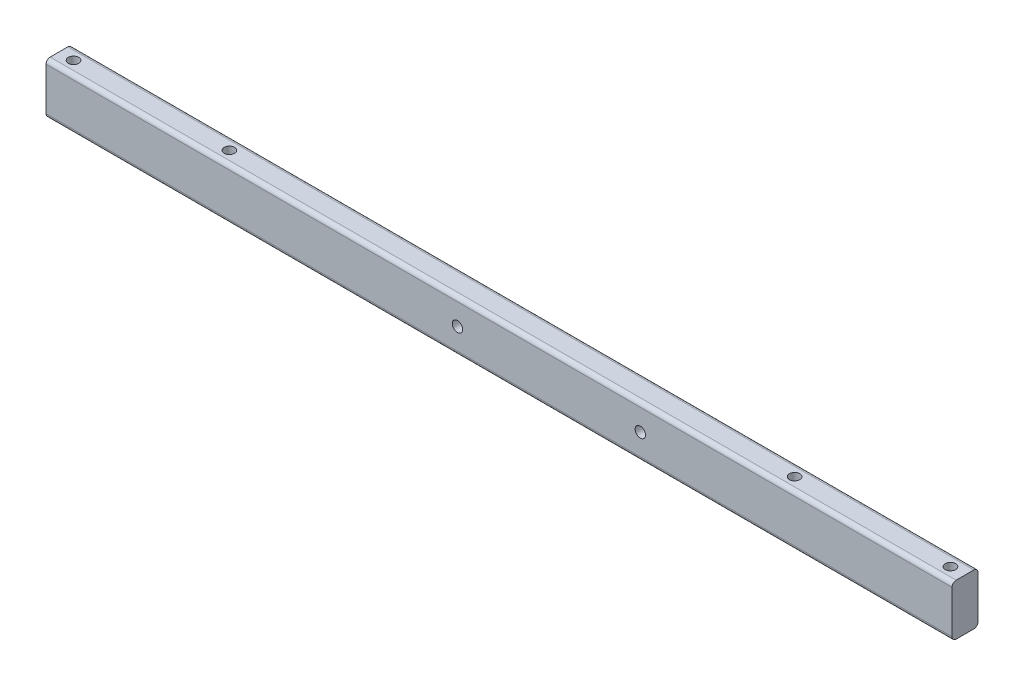
ISO-10303-21;
HEADER;
FILE_DESCRIPTION(('STEP AP214'),'2;1');
FILE_NAME('part.step','',(''),(''),'','','');
FILE_SCHEMA(('AUTOMOTIVE_DESIGN { 1 0 10303 214 1 1 1 1 }'));
ENDSEC;
DATA;
#1=APPLICATION_CONTEXT('core data for automotive mechanical design processes');
#2=APPLICATION_PROTOCOL_DEFINITION('international standard','automotive_design',2000,#1);
#3=PRODUCT_CONTEXT('',#1,'mechanical');
#4=PRODUCT('Part','Part','',(#3));
#5=PRODUCT_RELATED_PRODUCT_CATEGORY('part','',(#4));
#6=PRODUCT_DEFINITION_FORMATION('','',#4);
#7=PRODUCT_DEFINITION_CONTEXT('part definition',#1,'design');
#8=PRODUCT_DEFINITION('design','',#6,#7);
#9=PRODUCT_DEFINITION_SHAPE('','',#8);
#10=(LENGTH_UNIT() NAMED_UNIT(*) SI_UNIT(.MILLI.,.METRE.));
#11=(NAMED_UNIT(*) PLANE_ANGLE_UNIT() SI_UNIT($,.RADIAN.));
#12=(NAMED_UNIT(*) SI_UNIT($,.STERADIAN.) SOLID_ANGLE_UNIT());
#13=UNCERTAINTY_MEASURE_WITH_UNIT(LENGTH_MEASURE(1.E-05),#10,'distance_accuracy_value','');
#14=(GEOMETRIC_REPRESENTATION_CONTEXT(3) GLOBAL_UNCERTAINTY_ASSIGNED_CONTEXT((#13)) GLOBAL_UNIT_ASSIGNED_CONTEXT((#10,
#11,#12)) REPRESENTATION_CONTEXT('',''));
#15=CARTESIAN_POINT('',(0.,0.,0.));
#16=DIRECTION('',(0.,0.,1.));
#17=DIRECTION('',(1.,0.,0.));
#18=AXIS2_PLACEMENT_3D('',#15,#16,#17);
#19=CARTESIAN_POINT('',(0.,0.,6.25));
#20=DIRECTION('',(0.,0.,1.));
#21=DIRECTION('',(-1.,0.,0.));
#22=AXIS2_PLACEMENT_3D('',#19,#20,#21);
#23=PLANE('',#22);
#24=DIRECTION('',(0.,-1.,0.));
#25=VECTOR('',#24,1.);
#26=CARTESIAN_POINT('',(0.,0.,6.25));
#27=LINE('',#26,#25);
#28=CARTESIAN_POINT('',(0.,11.3,6.25));
#29=VERTEX_POINT('',#28);
#30=CARTESIAN_POINT('',(0.,1.,6.25));
#31=VERTEX_POINT('',#30);
#32=EDGE_CURVE('E129',#29,#31,#27,.T.);
#33=ORIENTED_EDGE('',*,*,#32,.F.);
#34=DIRECTION('',(-1.,0.,0.));
#35=VECTOR('',#34,1.);
#36=CARTESIAN_POINT('',(0.,11.3,6.25));
#37=LINE('',#36,#35);
#38=CARTESIAN_POINT('',(218.,11.3,6.25));
#39=VERTEX_POINT('',#38);
#40=EDGE_CURVE('E44',#39,#29,#37,.T.);
#41=ORIENTED_EDGE('',*,*,#40,.F.);
#42=DIRECTION('',(0.,1.,0.));
#43=VECTOR('',#42,1.);
#44=CARTESIAN_POINT('',(218.,0.,6.25));
#45=LINE('',#44,#43);
#46=CARTESIAN_POINT('',(218.,1.,6.25));
#47=VERTEX_POINT('',#46);
#48=EDGE_CURVE('E124',#47,#39,#45,.T.);
#49=ORIENTED_EDGE('',*,*,#48,.F.);
#50=DIRECTION('',(1.,0.,0.));
#51=VECTOR('',#50,1.);
#52=CARTESIAN_POINT('',(0.,1.,6.25));
#53=LINE('',#52,#51);
#54=EDGE_CURVE('E11',#31,#47,#53,.T.);
#55=ORIENTED_EDGE('',*,*,#54,.F.);
#56=EDGE_LOOP('',(#33,#41,#49,#55));
#57=FACE_BOUND('',#56,.T.);
#58=CARTESIAN_POINT('',(143.,6.15,6.25));
#59=DIRECTION('',(0.,0.,1.));
#60=DIRECTION('',(1.,0.,0.));
#61=AXIS2_PLACEMENT_3D('',#58,#59,#60);
#62=CIRCLE('',#61,1.25000000000001);
#63=CARTESIAN_POINT('',(144.25,6.15,6.25));
#64=VERTEX_POINT('',#63);
#65=EDGE_CURVE('E181',#64,#64,#62,.T.);
#66=ORIENTED_EDGE('',*,*,#65,.T.);
#67=EDGE_LOOP('',(#66));
#68=FACE_BOUND('',#67,.T.);
#69=CARTESIAN_POINT('',(99.,6.15,6.25));
#70=DIRECTION('',(0.,0.,1.));
#71=DIRECTION('',(1.,0.,0.));
#72=AXIS2_PLACEMENT_3D('',#69,#70,#71);
#73=CIRCLE('',#72,1.25);
#74=CARTESIAN_POINT('',(100.25,6.15,6.25));
#75=VERTEX_POINT('',#74);
#76=EDGE_CURVE('E188',#75,#75,#73,.T.);
#77=ORIENTED_EDGE('',*,*,#76,.T.);
#78=EDGE_LOOP('',(#77));
#79=FACE_BOUND('',#78,.T.);
#80=ADVANCED_FACE('F36',(#57,#68,#79),#23,.F.);
#81=CARTESIAN_POINT('',(0.,0.,12.5));
#82=DIRECTION('',(0.,0.,1.));
#83=DIRECTION('',(-1.,0.,0.));
#84=AXIS2_PLACEMENT_3D('',#81,#82,#83);
#85=PLANE('',#84);
#86=CARTESIAN_POINT('',(143.,6.15,12.5));
#87=DIRECTION('',(0.,0.,1.));
#88=DIRECTION('',(1.,0.,0.));
#89=AXIS2_PLACEMENT_3D('',#86,#87,#88);
#90=CIRCLE('',#89,1.25000000000001);
#91=CARTESIAN_POINT('',(144.25,6.15,12.5));
#92=VERTEX_POINT('',#91);
#93=EDGE_CURVE('E178',#92,#92,#90,.T.);
#94=ORIENTED_EDGE('',*,*,#93,.F.);
#95=EDGE_LOOP('',(#94));
#96=FACE_BOUND('',#95,.T.);
#97=DIRECTION('',(0.,-1.,0.));
#98=VECTOR('',#97,1.);
#99=CARTESIAN_POINT('',(0.,0.,12.5));
#100=LINE('',#99,#98);
#101=CARTESIAN_POINT('',(0.,11.3,12.5));
#102=VERTEX_POINT('',#101);
#103=CARTESIAN_POINT('',(0.,1.,12.5));
#104=VERTEX_POINT('',#103);
#105=EDGE_CURVE('E176',#102,#104,#100,.T.);
#106=ORIENTED_EDGE('',*,*,#105,.T.);
#107=DIRECTION('',(1.,0.,0.));
#108=VECTOR('',#107,1.);
#109=CARTESIAN_POINT('',(0.,1.,12.5));
#110=LINE('',#109,#108);
#111=CARTESIAN_POINT('',(218.,1.,12.5));
#112=VERTEX_POINT('',#111);
#113=EDGE_CURVE('E145',#112,#104,#110,.F.);
#114=ORIENTED_EDGE('',*,*,#113,.F.);
#115=DIRECTION('',(0.,1.,0.));
#116=VECTOR('',#115,1.);
#117=CARTESIAN_POINT('',(218.,0.,12.5));
#118=LINE('',#117,#116);
#119=CARTESIAN_POINT('',(218.,11.3,12.5));
#120=VERTEX_POINT('',#119);
#121=EDGE_CURVE('E132',#112,#120,#118,.T.);
#122=ORIENTED_EDGE('',*,*,#121,.T.);
#123=DIRECTION('',(-1.,0.,0.));
#124=VECTOR('',#123,1.);
#125=CARTESIAN_POINT('',(218.,11.3,12.5));
#126=LINE('',#125,#124);
#127=EDGE_CURVE('E148',#102,#120,#126,.F.);
#128=ORIENTED_EDGE('',*,*,#127,.F.);
#129=EDGE_LOOP('',(#106,#114,#122,#128));
#130=FACE_BOUND('',#129,.T.);
#131=CARTESIAN_POINT('',(99.,6.15,12.5));
#132=DIRECTION('',(0.,0.,1.));
#133=DIRECTION('',(1.,0.,0.));
#134=AXIS2_PLACEMENT_3D('',#131,#132,#133);
#135=CIRCLE('',#134,1.25);
#136=CARTESIAN_POINT('',(100.25,6.15,12.5));
#137=VERTEX_POINT('',#136);
#138=EDGE_CURVE('E190',#137,#137,#135,.T.);
#139=ORIENTED_EDGE('',*,*,#138,.F.);
#140=EDGE_LOOP('',(#139));
#141=FACE_BOUND('',#140,.T.);
#142=ADVANCED_FACE('F236',(#96,#130,#141),#85,.T.);
#143=CARTESIAN_POINT('',(0.,0.,6.25));
#144=DIRECTION('',(1.,0.,0.));
#145=DIRECTION('',(0.,0.,1.));
#146=AXIS2_PLACEMENT_3D('',#143,#144,#145);
#147=PLANE('',#146);
#148=DIRECTION('',(0.,0.,1.));
#149=VECTOR('',#148,1.);
#150=CARTESIAN_POINT('',(0.,12.3,6.25));
#151=LINE('',#150,#149);
#152=CARTESIAN_POINT('',(0.,12.3,7.25));
#153=VERTEX_POINT('',#152);
#154=CARTESIAN_POINT('',(0.,12.3,11.5));
#155=VERTEX_POINT('',#154);
#156=EDGE_CURVE('E104',#153,#155,#151,.T.);
#157=ORIENTED_EDGE('',*,*,#156,.F.);
#158=CARTESIAN_POINT('',(0.,11.3,7.25));
#159=DIRECTION('',(-1.,0.,0.));
#160=DIRECTION('',(0.,0.,1.));
#161=AXIS2_PLACEMENT_3D('',#158,#159,#160);
#162=CIRCLE('',#161,1.);
#163=EDGE_CURVE('E113',#29,#153,#162,.F.);
#164=ORIENTED_EDGE('',*,*,#163,.F.);
#165=ORIENTED_EDGE('',*,*,#32,.T.);
#166=CARTESIAN_POINT('',(0.,1.,7.25));
#167=DIRECTION('',(-1.,0.,0.));
#168=DIRECTION('',(0.,0.,1.));
#169=AXIS2_PLACEMENT_3D('',#166,#167,#168);
#170=CIRCLE('',#169,1.);
#171=CARTESIAN_POINT('',(0.,0.,7.25));
#172=VERTEX_POINT('',#171);
#173=EDGE_CURVE('E118',#172,#31,#170,.F.);
#174=ORIENTED_EDGE('',*,*,#173,.F.);
#175=DIRECTION('',(0.,0.,1.));
#176=VECTOR('',#175,1.);
#177=CARTESIAN_POINT('',(0.,0.,6.25));
#178=LINE('',#177,#176);
#179=CARTESIAN_POINT('',(0.,0.,11.5));
#180=VERTEX_POINT('',#179);
#181=EDGE_CURVE('E110',#172,#180,#178,.T.);
#182=ORIENTED_EDGE('',*,*,#181,.T.);
#183=CARTESIAN_POINT('',(0.,1.,11.5));
#184=DIRECTION('',(-1.,0.,0.));
#185=DIRECTION('',(0.,0.,1.));
#186=AXIS2_PLACEMENT_3D('',#183,#184,#185);
#187=CIRCLE('',#186,1.);
#188=EDGE_CURVE('E141',#104,#180,#187,.F.);
#189=ORIENTED_EDGE('',*,*,#188,.F.);
#190=ORIENTED_EDGE('',*,*,#105,.F.);
#191=CARTESIAN_POINT('',(0.,11.3,11.5));
#192=DIRECTION('',(-1.,0.,0.));
#193=DIRECTION('',(0.,0.,1.));
#194=AXIS2_PLACEMENT_3D('',#191,#192,#193);
#195=CIRCLE('',#194,1.);
#196=EDGE_CURVE('E123',#155,#102,#195,.F.);
#197=ORIENTED_EDGE('',*,*,#196,.F.);
#198=EDGE_LOOP('',(#157,#164,#165,#174,#182,#189,#190,#197));
#199=FACE_BOUND('',#198,.T.);
#200=ADVANCED_FACE('F121',(#199),#147,.F.);
#201=CARTESIAN_POINT('',(0.,0.,6.25));
#202=DIRECTION('',(0.,1.,0.));
#203=DIRECTION('',(0.,0.,-1.));
#204=AXIS2_PLACEMENT_3D('',#201,#202,#203);
#205=PLANE('',#204);
#206=ORIENTED_EDGE('',*,*,#181,.F.);
#207=DIRECTION('',(1.,0.,0.));
#208=VECTOR('',#207,1.);
#209=CARTESIAN_POINT('',(0.,0.,7.25));
#210=LINE('',#209,#208);
#211=CARTESIAN_POINT('',(218.,0.,7.25));
#212=VERTEX_POINT('',#211);
#213=EDGE_CURVE('E158',#212,#172,#210,.F.);
#214=ORIENTED_EDGE('',*,*,#213,.F.);
#215=DIRECTION('',(0.,0.,1.));
#216=VECTOR('',#215,1.);
#217=CARTESIAN_POINT('',(218.,0.,6.25));
#218=LINE('',#217,#216);
#219=CARTESIAN_POINT('',(218.,0.,11.5));
#220=VERTEX_POINT('',#219);
#221=EDGE_CURVE('E126',#212,#220,#218,.T.);
#222=ORIENTED_EDGE('',*,*,#221,.T.);
#223=DIRECTION('',(1.,0.,0.));
#224=VECTOR('',#223,1.);
#225=CARTESIAN_POINT('',(218.,0.,11.5));
#226=LINE('',#225,#224);
#227=EDGE_CURVE('E160',#180,#220,#226,.T.);
#228=ORIENTED_EDGE('',*,*,#227,.F.);
#229=EDGE_LOOP('',(#206,#214,#222,#228));
#230=FACE_BOUND('',#229,.T.);
#231=ADVANCED_FACE('F166',(#230),#205,.F.);
#232=CARTESIAN_POINT('',(218.,0.,6.25));
#233=DIRECTION('',(-1.,0.,0.));
#234=DIRECTION('',(0.,0.,-1.));
#235=AXIS2_PLACEMENT_3D('',#232,#233,#234);
#236=PLANE('',#235);
#237=ORIENTED_EDGE('',*,*,#121,.F.);
#238=CARTESIAN_POINT('',(218.,1.,11.5));
#239=DIRECTION('',(1.,0.,0.));
#240=DIRECTION('',(0.,0.,-1.));
#241=AXIS2_PLACEMENT_3D('',#238,#239,#240);
#242=CIRCLE('',#241,1.);
#243=EDGE_CURVE('E51',#220,#112,#242,.F.);
#244=ORIENTED_EDGE('',*,*,#243,.F.);
#245=ORIENTED_EDGE('',*,*,#221,.F.);
#246=CARTESIAN_POINT('',(218.,1.,7.25));
#247=DIRECTION('',(1.,0.,0.));
#248=DIRECTION('',(0.,0.,-1.));
#249=AXIS2_PLACEMENT_3D('',#246,#247,#248);
#250=CIRCLE('',#249,1.);
#251=EDGE_CURVE('E58',#47,#212,#250,.F.);
#252=ORIENTED_EDGE('',*,*,#251,.F.);
#253=ORIENTED_EDGE('',*,*,#48,.T.);
#254=CARTESIAN_POINT('',(218.,11.3,7.25));
#255=DIRECTION('',(1.,0.,0.));
#256=DIRECTION('',(0.,0.,-1.));
#257=AXIS2_PLACEMENT_3D('',#254,#255,#256);
#258=CIRCLE('',#257,1.);
#259=CARTESIAN_POINT('',(218.,12.3,7.25));
#260=VERTEX_POINT('',#259);
#261=EDGE_CURVE('E151',#260,#39,#258,.F.);
#262=ORIENTED_EDGE('',*,*,#261,.F.);
#263=DIRECTION('',(0.,0.,1.));
#264=VECTOR('',#263,1.);
#265=CARTESIAN_POINT('',(218.,12.3,6.25));
#266=LINE('',#265,#264);
#267=CARTESIAN_POINT('',(218.,12.3,11.5));
#268=VERTEX_POINT('',#267);
#269=EDGE_CURVE('E106',#260,#268,#266,.T.);
#270=ORIENTED_EDGE('',*,*,#269,.T.);
#271=CARTESIAN_POINT('',(218.,11.3,11.5));
#272=DIRECTION('',(1.,0.,0.));
#273=DIRECTION('',(0.,0.,-1.));
#274=AXIS2_PLACEMENT_3D('',#271,#272,#273);
#275=CIRCLE('',#274,1.);
#276=EDGE_CURVE('E155',#120,#268,#275,.F.);
#277=ORIENTED_EDGE('',*,*,#276,.F.);
#278=EDGE_LOOP('',(#237,#244,#245,#252,#253,#262,#270,#277));
#279=FACE_BOUND('',#278,.T.);
#280=ADVANCED_FACE('F167',(#279),#236,.F.);
#281=CARTESIAN_POINT('',(0.,12.3,6.25));
#282=DIRECTION('',(0.,-1.,0.));
#283=DIRECTION('',(0.,0.,1.));
#284=AXIS2_PLACEMENT_3D('',#281,#282,#283);
#285=PLANE('',#284);
#286=CARTESIAN_POINT('',(214.5,12.3,9.37500000000001));
#287=DIRECTION('',(0.,-1.,0.));
#288=DIRECTION('',(0.,0.,-1.));
#289=AXIS2_PLACEMENT_3D('',#286,#287,#288);
#290=CIRCLE('',#289,1.25000000000001);
#291=CARTESIAN_POINT('',(214.5,12.3,8.125));
#292=VERTEX_POINT('',#291);
#293=EDGE_CURVE('E209',#292,#292,#290,.T.);
#294=ORIENTED_EDGE('',*,*,#293,.T.);
#295=EDGE_LOOP('',(#294));
#296=FACE_BOUND('',#295,.T.);
#297=CARTESIAN_POINT('',(41.,12.3,9.37500000000001));
#298=DIRECTION('',(0.,-1.,0.));
#299=DIRECTION('',(0.,0.,1.));
#300=AXIS2_PLACEMENT_3D('',#297,#298,#299);
#301=CIRCLE('',#300,1.25000000000001);
#302=CARTESIAN_POINT('',(41.,12.3,10.625));
#303=VERTEX_POINT('',#302);
#304=EDGE_CURVE('E210',#303,#303,#301,.T.);
#305=ORIENTED_EDGE('',*,*,#304,.T.);
#306=EDGE_LOOP('',(#305));
#307=FACE_BOUND('',#306,.T.);
#308=CARTESIAN_POINT('',(3.5,12.3,9.37500000000001));
#309=DIRECTION('',(0.,-1.,0.));
#310=DIRECTION('',(0.,0.,1.));
#311=AXIS2_PLACEMENT_3D('',#308,#309,#310);
#312=CIRCLE('',#311,1.25000000000001);
#313=CARTESIAN_POINT('',(3.5,12.3,10.625));
#314=VERTEX_POINT('',#313);
#315=EDGE_CURVE('E196',#314,#314,#312,.T.);
#316=ORIENTED_EDGE('',*,*,#315,.T.);
#317=EDGE_LOOP('',(#316));
#318=FACE_BOUND('',#317,.T.);
#319=CARTESIAN_POINT('',(177.,12.3,9.37500000000001));
#320=DIRECTION('',(0.,-1.,0.));
#321=DIRECTION('',(0.,0.,-1.));
#322=AXIS2_PLACEMENT_3D('',#319,#320,#321);
#323=CIRCLE('',#322,1.25000000000001);
#324=CARTESIAN_POINT('',(177.,12.3,8.125));
#325=VERTEX_POINT('',#324);
#326=EDGE_CURVE('E203',#325,#325,#323,.T.);
#327=ORIENTED_EDGE('',*,*,#326,.T.);
#328=EDGE_LOOP('',(#327));
#329=FACE_BOUND('',#328,.T.);
#330=ORIENTED_EDGE('',*,*,#269,.F.);
#331=DIRECTION('',(-1.,0.,0.));
#332=VECTOR('',#331,1.);
#333=CARTESIAN_POINT('',(0.,12.3,7.25));
#334=LINE('',#333,#332);
#335=EDGE_CURVE('E100',#153,#260,#334,.F.);
#336=ORIENTED_EDGE('',*,*,#335,.F.);
#337=ORIENTED_EDGE('',*,*,#156,.T.);
#338=DIRECTION('',(-1.,0.,0.));
#339=VECTOR('',#338,1.);
#340=CARTESIAN_POINT('',(0.,12.3,11.5));
#341=LINE('',#340,#339);
#342=EDGE_CURVE('E109',#268,#155,#341,.T.);
#343=ORIENTED_EDGE('',*,*,#342,.F.);
#344=EDGE_LOOP('',(#330,#336,#337,#343));
#345=FACE_BOUND('',#344,.T.);
#346=ADVANCED_FACE('F102',(#296,#307,#318,#329,#345),#285,.F.);
#347=CARTESIAN_POINT('',(143.,6.15,6.25));
#348=DIRECTION('',(0.,0.,1.));
#349=DIRECTION('',(-1.,0.,0.));
#350=AXIS2_PLACEMENT_3D('',#347,#348,#349);
#351=CYLINDRICAL_SURFACE('',#350,1.25000000000001);
#352=ORIENTED_EDGE('',*,*,#65,.F.);
#353=EDGE_LOOP('',(#352));
#354=FACE_BOUND('',#353,.T.);
#355=ORIENTED_EDGE('',*,*,#93,.T.);
#356=EDGE_LOOP('',(#355));
#357=FACE_BOUND('',#356,.T.);
#358=ADVANCED_FACE('F244',(#354,#357),#351,.F.);
#359=CARTESIAN_POINT('',(99.,6.15,6.25));
#360=DIRECTION('',(0.,0.,1.));
#361=DIRECTION('',(-1.,0.,0.));
#362=AXIS2_PLACEMENT_3D('',#359,#360,#361);
#363=CYLINDRICAL_SURFACE('',#362,1.25);
#364=ORIENTED_EDGE('',*,*,#76,.F.);
#365=EDGE_LOOP('',(#364));
#366=FACE_BOUND('',#365,.T.);
#367=ORIENTED_EDGE('',*,*,#138,.T.);
#368=EDGE_LOOP('',(#367));
#369=FACE_BOUND('',#368,.T.);
#370=ADVANCED_FACE('F349',(#366,#369),#363,.F.);
#371=CARTESIAN_POINT('',(177.,4.3,9.37500000000001));
#372=DIRECTION('',(0.,1.,0.));
#373=DIRECTION('',(0.,0.,-1.));
#374=AXIS2_PLACEMENT_3D('',#371,#372,#373);
#375=CYLINDRICAL_SURFACE('',#374,1.25000000000001);
#376=CARTESIAN_POINT('',(177.,4.3,9.37500000000001));
#377=DIRECTION('',(0.,-1.,0.));
#378=DIRECTION('',(0.,0.,-1.));
#379=AXIS2_PLACEMENT_3D('',#376,#377,#378);
#380=CIRCLE('',#379,1.25000000000001);
#381=CARTESIAN_POINT('',(177.,4.3,8.125));
#382=VERTEX_POINT('',#381);
#383=EDGE_CURVE('E206',#382,#382,#380,.T.);
#384=ORIENTED_EDGE('',*,*,#383,.T.);
#385=EDGE_LOOP('',(#384));
#386=FACE_BOUND('',#385,.T.);
#387=ORIENTED_EDGE('',*,*,#326,.F.);
#388=EDGE_LOOP('',(#387));
#389=FACE_BOUND('',#388,.T.);
#390=ADVANCED_FACE('F339',(#386,#389),#375,.F.);
#391=CARTESIAN_POINT('',(177.,4.3,9.37500000000001));
#392=DIRECTION('',(0.,1.,0.));
#393=DIRECTION('',(0.,0.,-1.));
#394=AXIS2_PLACEMENT_3D('',#391,#392,#393);
#395=PLANE('',#394);
#396=ORIENTED_EDGE('',*,*,#383,.F.);
#397=EDGE_LOOP('',(#396));
#398=FACE_BOUND('',#397,.T.);
#399=ADVANCED_FACE('F329',(#398),#395,.T.);
#400=CARTESIAN_POINT('',(3.5,4.3,9.37500000000001));
#401=DIRECTION('',(0.,1.,0.));
#402=DIRECTION('',(0.,0.,-1.));
#403=AXIS2_PLACEMENT_3D('',#400,#401,#402);
#404=CYLINDRICAL_SURFACE('',#403,1.25000000000001);
#405=CARTESIAN_POINT('',(3.5,4.3,9.37500000000001));
#406=DIRECTION('',(0.,-1.,0.));
#407=DIRECTION('',(0.,0.,1.));
#408=AXIS2_PLACEMENT_3D('',#405,#406,#407);
#409=CIRCLE('',#408,1.25000000000001);
#410=CARTESIAN_POINT('',(3.5,4.3,10.625));
#411=VERTEX_POINT('',#410);
#412=EDGE_CURVE('E199',#411,#411,#409,.T.);
#413=ORIENTED_EDGE('',*,*,#412,.T.);
#414=EDGE_LOOP('',(#413));
#415=FACE_BOUND('',#414,.T.);
#416=ORIENTED_EDGE('',*,*,#315,.F.);
#417=EDGE_LOOP('',(#416));
#418=FACE_BOUND('',#417,.T.);
#419=ADVANCED_FACE('F319',(#415,#418),#404,.F.);
#420=CARTESIAN_POINT('',(3.5,4.3,9.37500000000001));
#421=DIRECTION('',(0.,-1.,0.));
#422=DIRECTION('',(0.,0.,1.));
#423=AXIS2_PLACEMENT_3D('',#420,#421,#422);
#424=PLANE('',#423);
#425=ORIENTED_EDGE('',*,*,#412,.F.);
#426=EDGE_LOOP('',(#425));
#427=FACE_BOUND('',#426,.T.);
#428=ADVANCED_FACE('F309',(#427),#424,.F.);
#429=CARTESIAN_POINT('',(41.,4.3,9.37500000000001));
#430=DIRECTION('',(0.,1.,0.));
#431=DIRECTION('',(0.,0.,-1.));
#432=AXIS2_PLACEMENT_3D('',#429,#430,#431);
#433=CYLINDRICAL_SURFACE('',#432,1.25000000000001);
#434=CARTESIAN_POINT('',(41.,4.3,9.37500000000001));
#435=DIRECTION('',(0.,-1.,0.));
#436=DIRECTION('',(0.,0.,1.));
#437=AXIS2_PLACEMENT_3D('',#434,#435,#436);
#438=CIRCLE('',#437,1.25000000000001);
#439=CARTESIAN_POINT('',(41.,4.3,10.625));
#440=VERTEX_POINT('',#439);
#441=EDGE_CURVE('E200',#440,#440,#438,.T.);
#442=ORIENTED_EDGE('',*,*,#441,.T.);
#443=EDGE_LOOP('',(#442));
#444=FACE_BOUND('',#443,.T.);
#445=ORIENTED_EDGE('',*,*,#304,.F.);
#446=EDGE_LOOP('',(#445));
#447=FACE_BOUND('',#446,.T.);
#448=ADVANCED_FACE('F299',(#444,#447),#433,.F.);
#449=CARTESIAN_POINT('',(41.,4.3,9.37500000000001));
#450=DIRECTION('',(0.,-1.,0.));
#451=DIRECTION('',(0.,0.,1.));
#452=AXIS2_PLACEMENT_3D('',#449,#450,#451);
#453=PLANE('',#452);
#454=ORIENTED_EDGE('',*,*,#441,.F.);
#455=EDGE_LOOP('',(#454));
#456=FACE_BOUND('',#455,.T.);
#457=ADVANCED_FACE('F233',(#456),#453,.F.);
#458=CARTESIAN_POINT('',(214.5,4.3,9.37500000000001));
#459=DIRECTION('',(0.,1.,0.));
#460=DIRECTION('',(0.,0.,-1.));
#461=AXIS2_PLACEMENT_3D('',#458,#459,#460);
#462=CYLINDRICAL_SURFACE('',#461,1.25000000000001);
#463=CARTESIAN_POINT('',(214.5,4.3,9.37500000000001));
#464=DIRECTION('',(0.,-1.,0.));
#465=DIRECTION('',(0.,0.,-1.));
#466=AXIS2_PLACEMENT_3D('',#463,#464,#465);
#467=CIRCLE('',#466,1.25000000000001);
#468=CARTESIAN_POINT('',(214.5,4.3,8.125));
#469=VERTEX_POINT('',#468);
#470=EDGE_CURVE('E193',#469,#469,#467,.T.);
#471=ORIENTED_EDGE('',*,*,#470,.T.);
#472=EDGE_LOOP('',(#471));
#473=FACE_BOUND('',#472,.T.);
#474=ORIENTED_EDGE('',*,*,#293,.F.);
#475=EDGE_LOOP('',(#474));
#476=FACE_BOUND('',#475,.T.);
#477=ADVANCED_FACE('F220',(#473,#476),#462,.F.);
#478=CARTESIAN_POINT('',(214.5,4.3,9.37500000000001));
#479=DIRECTION('',(0.,1.,0.));
#480=DIRECTION('',(0.,0.,-1.));
#481=AXIS2_PLACEMENT_3D('',#478,#479,#480);
#482=PLANE('',#481);
#483=ORIENTED_EDGE('',*,*,#470,.F.);
#484=EDGE_LOOP('',(#483));
#485=FACE_BOUND('',#484,.T.);
#486=ADVANCED_FACE('F223',(#485),#482,.T.);
#487=CARTESIAN_POINT('',(0.,11.3,11.5));
#488=DIRECTION('',(1.,0.,0.));
#489=DIRECTION('',(0.,0.,1.));
#490=AXIS2_PLACEMENT_3D('',#487,#488,#489);
#491=CYLINDRICAL_SURFACE('',#490,1.);
#492=ORIENTED_EDGE('',*,*,#276,.T.);
#493=ORIENTED_EDGE('',*,*,#342,.T.);
#494=ORIENTED_EDGE('',*,*,#196,.T.);
#495=ORIENTED_EDGE('',*,*,#127,.T.);
#496=EDGE_LOOP('',(#492,#493,#494,#495));
#497=FACE_BOUND('',#496,.T.);
#498=ADVANCED_FACE('F225',(#497),#491,.T.);
#499=CARTESIAN_POINT('',(0.,1.,11.5));
#500=DIRECTION('',(-1.,0.,0.));
#501=DIRECTION('',(0.,0.,-1.));
#502=AXIS2_PLACEMENT_3D('',#499,#500,#501);
#503=CYLINDRICAL_SURFACE('',#502,1.);
#504=ORIENTED_EDGE('',*,*,#188,.T.);
#505=ORIENTED_EDGE('',*,*,#227,.T.);
#506=ORIENTED_EDGE('',*,*,#243,.T.);
#507=ORIENTED_EDGE('',*,*,#113,.T.);
#508=EDGE_LOOP('',(#504,#505,#506,#507));
#509=FACE_BOUND('',#508,.T.);
#510=ADVANCED_FACE('F162',(#509),#503,.T.);
#511=CARTESIAN_POINT('',(0.,1.,7.25));
#512=DIRECTION('',(1.,0.,0.));
#513=DIRECTION('',(0.,0.,1.));
#514=AXIS2_PLACEMENT_3D('',#511,#512,#513);
#515=CYLINDRICAL_SURFACE('',#514,1.);
#516=ORIENTED_EDGE('',*,*,#173,.T.);
#517=ORIENTED_EDGE('',*,*,#54,.T.);
#518=ORIENTED_EDGE('',*,*,#251,.T.);
#519=ORIENTED_EDGE('',*,*,#213,.T.);
#520=EDGE_LOOP('',(#516,#517,#518,#519));
#521=FACE_BOUND('',#520,.T.);
#522=ADVANCED_FACE('F170',(#521),#515,.T.);
#523=CARTESIAN_POINT('',(0.,11.3,7.25));
#524=DIRECTION('',(-1.,0.,0.));
#525=DIRECTION('',(0.,0.,-1.));
#526=AXIS2_PLACEMENT_3D('',#523,#524,#525);
#527=CYLINDRICAL_SURFACE('',#526,1.);
#528=ORIENTED_EDGE('',*,*,#261,.T.);
#529=ORIENTED_EDGE('',*,*,#40,.T.);
#530=ORIENTED_EDGE('',*,*,#163,.T.);
#531=ORIENTED_EDGE('',*,*,#335,.T.);
#532=EDGE_LOOP('',(#528,#529,#530,#531));
#533=FACE_BOUND('',#532,.T.);
#534=ADVANCED_FACE('F38',(#533),#527,.T.);
#535=CLOSED_SHELL('',(#80,#142,#200,#231,#280,#346,#358,#370,#390,#399,#419,#428,#448,#457,#477,
#486,#498,#510,#522,#534));
#536=MANIFOLD_SOLID_BREP('B2',#535);
#537=ADVANCED_BREP_SHAPE_REPRESENTATION('',(#18,#536),#14);
#538=SHAPE_DEFINITION_REPRESENTATION(#9,#537);
ENDSEC;
END-ISO-10303-21;
